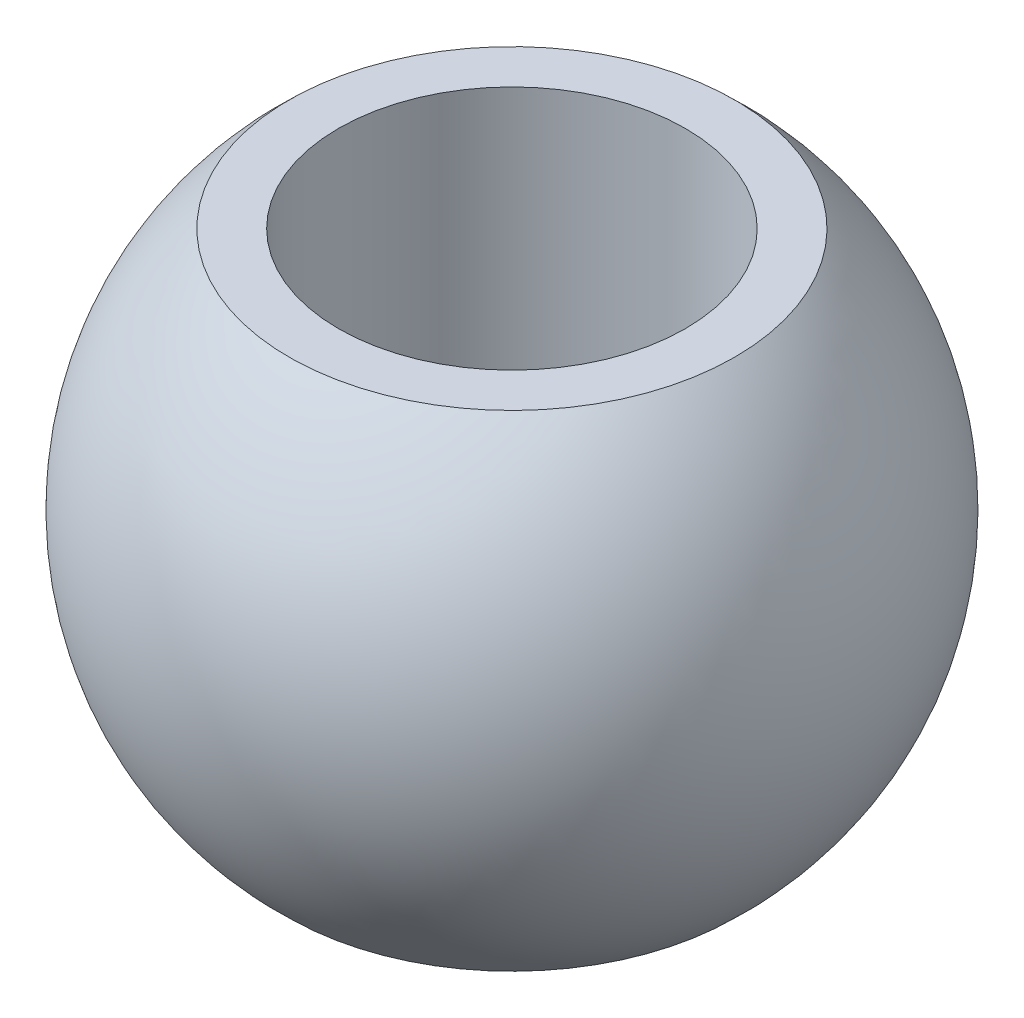
ISO-10303-21;
HEADER;
FILE_DESCRIPTION(('STEP AP214'),'2;1');
FILE_NAME('part.step','',(''),(''),'','','');
FILE_SCHEMA(('AUTOMOTIVE_DESIGN { 1 0 10303 214 1 1 1 1 }'));
ENDSEC;
DATA;
#1=APPLICATION_CONTEXT('core data for automotive mechanical design processes');
#2=APPLICATION_PROTOCOL_DEFINITION('international standard','automotive_design',2000,#1);
#3=PRODUCT_CONTEXT('',#1,'mechanical');
#4=PRODUCT('Part','Part','',(#3));
#5=PRODUCT_RELATED_PRODUCT_CATEGORY('part','',(#4));
#6=PRODUCT_DEFINITION_FORMATION('','',#4);
#7=PRODUCT_DEFINITION_CONTEXT('part definition',#1,'design');
#8=PRODUCT_DEFINITION('design','',#6,#7);
#9=PRODUCT_DEFINITION_SHAPE('','',#8);
#10=(LENGTH_UNIT() NAMED_UNIT(*) SI_UNIT(.MILLI.,.METRE.));
#11=(NAMED_UNIT(*) PLANE_ANGLE_UNIT() SI_UNIT($,.RADIAN.));
#12=(NAMED_UNIT(*) SI_UNIT($,.STERADIAN.) SOLID_ANGLE_UNIT());
#13=UNCERTAINTY_MEASURE_WITH_UNIT(LENGTH_MEASURE(1.E-05),#10,'distance_accuracy_value','');
#14=(GEOMETRIC_REPRESENTATION_CONTEXT(3) GLOBAL_UNCERTAINTY_ASSIGNED_CONTEXT((#13)) GLOBAL_UNIT_ASSIGNED_CONTEXT((#10,
#11,#12)) REPRESENTATION_CONTEXT('',''));
#15=CARTESIAN_POINT('',(0.,0.,0.));
#16=DIRECTION('',(0.,0.,1.));
#17=DIRECTION('',(1.,0.,0.));
#18=AXIS2_PLACEMENT_3D('',#15,#16,#17);
#19=CARTESIAN_POINT('',(0.,0.,0.));
#20=DIRECTION('',(0.,1.,0.));
#21=DIRECTION('',(1.,0.,0.));
#22=AXIS2_PLACEMENT_3D('',#19,#20,#21);
#23=SPHERICAL_SURFACE('',#22,9.5);
#24=CARTESIAN_POINT('',(0.,-7.,0.));
#25=DIRECTION('',(0.,1.,0.));
#26=DIRECTION('',(0.,0.,1.));
#27=AXIS2_PLACEMENT_3D('',#24,#25,#26);
#28=CIRCLE('',#27,6.42261628933256);
#29=CARTESIAN_POINT('',(6.42261628933256,-7.,0.));
#30=VERTEX_POINT('',#29);
#31=EDGE_CURVE('E10',#30,#30,#28,.T.);
#32=CARTESIAN_POINT('',(0.,7.,0.));
#33=DIRECTION('',(0.,1.,0.));
#34=DIRECTION('',(0.,0.,1.));
#35=AXIS2_PLACEMENT_3D('',#32,#33,#34);
#36=CIRCLE('',#35,6.42261628933256);
#37=CARTESIAN_POINT('',(6.42261628933257,7.,0.));
#38=VERTEX_POINT('',#37);
#39=EDGE_CURVE('E45',#38,#38,#36,.T.);
#40=CARTESIAN_POINT('',(6.42261628933256,-7.,0.));
#41=CARTESIAN_POINT('',(6.54342569413601,-6.88916090150671,0.));
#42=CARTESIAN_POINT('',(6.66136003251359,-6.77518881405934,0.));
#43=CARTESIAN_POINT('',(6.89117531051059,-6.54129667484051,0.));
#44=CARTESIAN_POINT('',(7.00305625013002,-6.42137662306904,0.));
#45=CARTESIAN_POINT('',(7.22046146470429,-6.17590656878604,0.));
#46=CARTESIAN_POINT('',(7.32598573965915,-6.0503565662745,0.));
#47=CARTESIAN_POINT('',(7.53039574159127,-5.79396398340499,0.));
#48=CARTESIAN_POINT('',(7.62928146856853,-5.66312140304703,0.));
#49=CARTESIAN_POINT('',(7.82014911759014,-5.39649407686297,0.));
#50=CARTESIAN_POINT('',(7.91213103963449,-5.26070933103688,0.));
#51=CARTESIAN_POINT('',(8.08894463592214,-4.98456163781066,0.));
#52=CARTESIAN_POINT('',(8.17377631016544,-4.84419869041052,0.));
#53=CARTESIAN_POINT('',(8.33606204680926,-4.55927074520562,0.));
#54=CARTESIAN_POINT('',(8.41351610920976,-4.41470574740086,0.));
#55=CARTESIAN_POINT('',(8.56083905231442,-4.12176113594363,0.));
#56=CARTESIAN_POINT('',(8.63070793301858,-3.97338152229117,0.));
#57=CARTESIAN_POINT('',(8.76267326493481,-3.67320533085327,0.));
#58=CARTESIAN_POINT('',(8.82476971614688,-3.52140875306783,0.));
#59=CARTESIAN_POINT('',(8.94102377277238,-3.21480544402196,0.));
#60=CARTESIAN_POINT('',(8.99518137818579,-3.05999871276152,0.));
#61=CARTESIAN_POINT('',(9.0954126023475,-2.74778997412203,0.));
#62=CARTESIAN_POINT('',(9.14148622109578,-2.59038796674298,0.));
#63=CARTESIAN_POINT('',(9.22542599602061,-2.27341050859914,0.));
#64=CARTESIAN_POINT('',(9.26329215219716,-2.11383505783435,0.));
#65=CARTESIAN_POINT('',(9.3307155217971,-1.79293837038526,0.));
#66=CARTESIAN_POINT('',(9.36027273522048,-1.63161713370095,0.));
#67=CARTESIAN_POINT('',(9.41099900686099,-1.30766121054168,0.));
#68=CARTESIAN_POINT('',(9.4321680650781,-1.14502652406671,0.));
#69=CARTESIAN_POINT('',(9.46606129385776,-0.81887955745923,0.));
#70=CARTESIAN_POINT('',(9.4787854644203,-0.655367277326715,0.));
#71=CARTESIAN_POINT('',(9.49575481749142,-0.3279033314628,0.));
#72=CARTESIAN_POINT('',(9.5,-0.163951665731401,0.));
#73=CARTESIAN_POINT('',(9.5,0.163951665731397,0.));
#74=CARTESIAN_POINT('',(9.49575481749142,0.327903331462796,0.));
#75=CARTESIAN_POINT('',(9.4787854644203,0.65536727732671,0.));
#76=CARTESIAN_POINT('',(9.46606129385776,0.818879557459225,0.));
#77=CARTESIAN_POINT('',(9.4321680650781,1.14502652406671,0.));
#78=CARTESIAN_POINT('',(9.41099900686099,1.30766121054168,0.));
#79=CARTESIAN_POINT('',(9.36027273522048,1.63161713370095,0.));
#80=CARTESIAN_POINT('',(9.3307155217971,1.79293837038525,0.));
#81=CARTESIAN_POINT('',(9.26329215219716,2.11383505783435,0.));
#82=CARTESIAN_POINT('',(9.22542599602061,2.27341050859914,0.));
#83=CARTESIAN_POINT('',(9.14148622109579,2.59038796674298,0.));
#84=CARTESIAN_POINT('',(9.0954126023475,2.74778997412203,0.));
#85=CARTESIAN_POINT('',(8.99518137818579,3.05999871276152,0.));
#86=CARTESIAN_POINT('',(8.94102377277238,3.21480544402196,0.));
#87=CARTESIAN_POINT('',(8.82476971614688,3.52140875306783,0.));
#88=CARTESIAN_POINT('',(8.76267326493481,3.67320533085326,0.));
#89=CARTESIAN_POINT('',(8.63070793301858,3.97338152229116,0.));
#90=CARTESIAN_POINT('',(8.56083905231443,4.12176113594363,0.));
#91=CARTESIAN_POINT('',(8.41351610920976,4.41470574740086,0.));
#92=CARTESIAN_POINT('',(8.33606204680926,4.55927074520562,0.));
#93=CARTESIAN_POINT('',(8.17377631016545,4.84419869041052,0.));
#94=CARTESIAN_POINT('',(8.08894463592214,4.98456163781065,0.));
#95=CARTESIAN_POINT('',(7.91213103963449,5.26070933103688,0.));
#96=CARTESIAN_POINT('',(7.82014911759014,5.39649407686297,0.));
#97=CARTESIAN_POINT('',(7.62928146856853,5.66312140304702,0.));
#98=CARTESIAN_POINT('',(7.53039574159127,5.79396398340499,0.));
#99=CARTESIAN_POINT('',(7.32598573965915,6.05035656627449,0.));
#100=CARTESIAN_POINT('',(7.2204614647043,6.17590656878603,0.));
#101=CARTESIAN_POINT('',(7.00305625013002,6.42137662306904,0.));
#102=CARTESIAN_POINT('',(6.89117531051059,6.54129667484051,0.));
#103=CARTESIAN_POINT('',(6.66136003251359,6.77518881405934,0.));
#104=CARTESIAN_POINT('',(6.54342569413601,6.8891609015067,0.));
#105=CARTESIAN_POINT('',(6.42261628933257,7.,0.));
#106=B_SPLINE_CURVE_WITH_KNOTS('',3,(#40,#41,#42,#43,#44,#45,#46,#47,#48,#49,#50,#51,#52,#53,
#54,#55,#56,#57,#58,#59,#60,#61,#62,#63,#64,#65,#66,#67,#68,#69,#70,#71,#72,#73,#74,#75,#76,#77,
#78,#79,#80,#81,#82,#83,#84,#85,#86,#87,#88,#89,#90,#91,#92,#93,#94,#95,#96,#97,#98,#99,#100,
#101,#102,#103,#104,#105),.UNSPECIFIED.,.F.,.F.,(4,2,2,2,2,2,2,2,2,2,2,2,2,2,2,2,2,2,2,2,2,2,2,
2,2,2,2,2,2,2,2,2,4),(0.,0.491800083203133,0.983600166406264,1.4754002496094,1.96720033281253,
2.45900041601566,2.95080049921879,3.44260058242192,3.93440066562505,4.42620074882818,
4.91800083203132,5.40980091523445,5.90160099843758,6.39340108164071,6.88520116484384,
7.37700124804697,7.86880133125011,8.36060141445324,8.85240149765637,9.3442015808595,
9.83600166406263,10.3278017472658,10.8196018304689,11.311401913672,11.8032019968752,
12.2950020800783,12.7868021632814,13.2786022464846,13.7704023296877,14.2622024128908,
14.7540024960939,15.2458025792971,15.7376026625002),.UNSPECIFIED.);
#107=EDGE_CURVE('BSEAM31',#30,#38,#106,.T.);
#108=ORIENTED_EDGE('',*,*,#31,.T.);
#109=ORIENTED_EDGE('',*,*,#39,.F.);
#110=ORIENTED_EDGE('',*,*,#107,.T.);
#111=ORIENTED_EDGE('',*,*,#107,.F.);
#112=EDGE_LOOP('',(#108,#110,#109,#111));
#113=FACE_BOUND('',#112,.T.);
#114=ADVANCED_FACE('F31',(#113),#23,.T.);
#115=CARTESIAN_POINT('',(6.42261628933256,-7.,0.));
#116=DIRECTION('',(0.,-1.,0.));
#117=DIRECTION('',(0.,0.,-1.));
#118=AXIS2_PLACEMENT_3D('',#115,#116,#117);
#119=PLANE('',#118);
#120=CARTESIAN_POINT('',(0.,-7.,0.));
#121=DIRECTION('',(0.,1.,0.));
#122=DIRECTION('',(0.,0.,1.));
#123=AXIS2_PLACEMENT_3D('',#120,#121,#122);
#124=CIRCLE('',#123,5.);
#125=CARTESIAN_POINT('',(0.,-7.,5.));
#126=VERTEX_POINT('',#125);
#127=EDGE_CURVE('E37',#126,#126,#124,.T.);
#128=ORIENTED_EDGE('',*,*,#127,.T.);
#129=EDGE_LOOP('',(#128));
#130=FACE_BOUND('',#129,.T.);
#131=ORIENTED_EDGE('',*,*,#31,.F.);
#132=EDGE_LOOP('',(#131));
#133=FACE_BOUND('',#132,.T.);
#134=ADVANCED_FACE('F55',(#130,#133),#119,.T.);
#135=CARTESIAN_POINT('',(0.,-7.,0.));
#136=DIRECTION('',(0.,1.,0.));
#137=DIRECTION('',(0.,0.,1.));
#138=AXIS2_PLACEMENT_3D('',#135,#136,#137);
#139=CYLINDRICAL_SURFACE('',#138,5.);
#140=CARTESIAN_POINT('',(0.,7.,0.));
#141=DIRECTION('',(0.,1.,0.));
#142=DIRECTION('',(0.,0.,1.));
#143=AXIS2_PLACEMENT_3D('',#140,#141,#142);
#144=CIRCLE('',#143,5.);
#145=CARTESIAN_POINT('',(0.,7.,5.));
#146=VERTEX_POINT('',#145);
#147=EDGE_CURVE('E41',#146,#146,#144,.T.);
#148=ORIENTED_EDGE('',*,*,#147,.T.);
#149=EDGE_LOOP('',(#148));
#150=FACE_BOUND('',#149,.T.);
#151=ORIENTED_EDGE('',*,*,#127,.F.);
#152=EDGE_LOOP('',(#151));
#153=FACE_BOUND('',#152,.T.);
#154=ADVANCED_FACE('F59',(#150,#153),#139,.F.);
#155=CARTESIAN_POINT('',(5.,7.,0.));
#156=DIRECTION('',(0.,1.,0.));
#157=DIRECTION('',(0.,0.,1.));
#158=AXIS2_PLACEMENT_3D('',#155,#156,#157);
#159=PLANE('',#158);
#160=ORIENTED_EDGE('',*,*,#39,.T.);
#161=EDGE_LOOP('',(#160));
#162=FACE_BOUND('',#161,.T.);
#163=ORIENTED_EDGE('',*,*,#147,.F.);
#164=EDGE_LOOP('',(#163));
#165=FACE_BOUND('',#164,.T.);
#166=ADVANCED_FACE('F51',(#162,#165),#159,.T.);
#167=CLOSED_SHELL('',(#114,#134,#154,#166));
#168=MANIFOLD_SOLID_BREP('B2',#167);
#169=ADVANCED_BREP_SHAPE_REPRESENTATION('',(#18,#168),#14);
#170=SHAPE_DEFINITION_REPRESENTATION(#9,#169);
ENDSEC;
END-ISO-10303-21;
